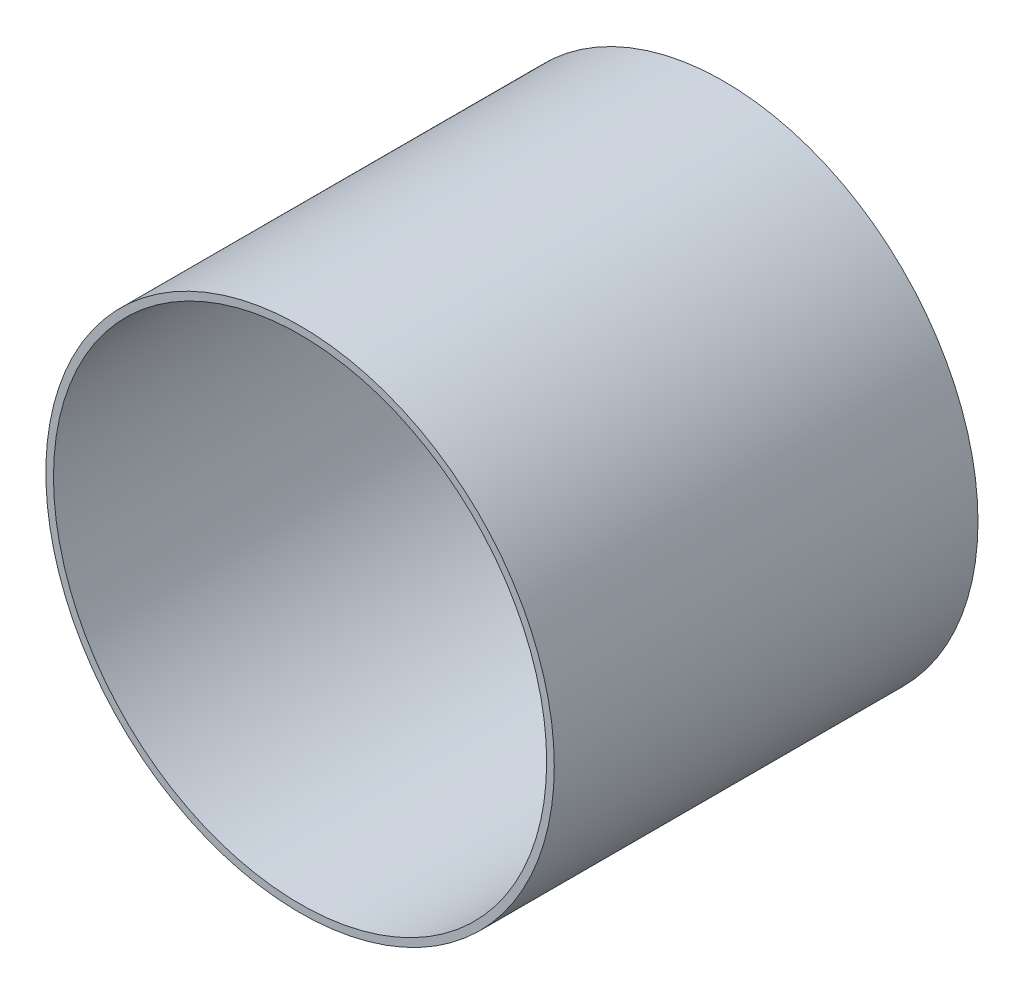
ISO-10303-21;
HEADER;
FILE_DESCRIPTION(('STEP AP214'),'2;1');
FILE_NAME('part.step','',(''),(''),'','','');
FILE_SCHEMA(('AUTOMOTIVE_DESIGN { 1 0 10303 214 1 1 1 1 }'));
ENDSEC;
DATA;
#1=APPLICATION_CONTEXT('core data for automotive mechanical design processes');
#2=APPLICATION_PROTOCOL_DEFINITION('international standard','automotive_design',2000,#1);
#3=PRODUCT_CONTEXT('',#1,'mechanical');
#4=PRODUCT('Part','Part','',(#3));
#5=PRODUCT_RELATED_PRODUCT_CATEGORY('part','',(#4));
#6=PRODUCT_DEFINITION_FORMATION('','',#4);
#7=PRODUCT_DEFINITION_CONTEXT('part definition',#1,'design');
#8=PRODUCT_DEFINITION('design','',#6,#7);
#9=PRODUCT_DEFINITION_SHAPE('','',#8);
#10=(LENGTH_UNIT() NAMED_UNIT(*) SI_UNIT(.MILLI.,.METRE.));
#11=(NAMED_UNIT(*) PLANE_ANGLE_UNIT() SI_UNIT($,.RADIAN.));
#12=(NAMED_UNIT(*) SI_UNIT($,.STERADIAN.) SOLID_ANGLE_UNIT());
#13=UNCERTAINTY_MEASURE_WITH_UNIT(LENGTH_MEASURE(1.E-05),#10,'distance_accuracy_value','');
#14=(GEOMETRIC_REPRESENTATION_CONTEXT(3) GLOBAL_UNCERTAINTY_ASSIGNED_CONTEXT((#13)) GLOBAL_UNIT_ASSIGNED_CONTEXT((#10,
#11,#12)) REPRESENTATION_CONTEXT('',''));
#15=CARTESIAN_POINT('',(0.,0.,0.));
#16=DIRECTION('',(0.,0.,1.));
#17=DIRECTION('',(1.,0.,0.));
#18=AXIS2_PLACEMENT_3D('',#15,#16,#17);
#19=CARTESIAN_POINT('',(0.,0.,25.));
#20=DIRECTION('',(0.,0.,1.));
#21=DIRECTION('',(1.,0.,0.));
#22=AXIS2_PLACEMENT_3D('',#19,#20,#21);
#23=PLANE('',#22);
#24=CARTESIAN_POINT('',(0.,0.,25.));
#25=DIRECTION('',(0.,0.,1.));
#26=DIRECTION('',(1.,0.,0.));
#27=AXIS2_PLACEMENT_3D('',#24,#25,#26);
#28=CIRCLE('',#27,15.);
#29=CARTESIAN_POINT('',(15.,0.,25.));
#30=VERTEX_POINT('',#29);
#31=EDGE_CURVE('E10',#30,#30,#28,.T.);
#32=ORIENTED_EDGE('',*,*,#31,.T.);
#33=EDGE_LOOP('',(#32));
#34=FACE_BOUND('',#33,.T.);
#35=CARTESIAN_POINT('',(0.,0.,25.));
#36=DIRECTION('',(0.,0.,1.));
#37=DIRECTION('',(1.,0.,0.));
#38=AXIS2_PLACEMENT_3D('',#35,#36,#37);
#39=CIRCLE('',#38,14.55);
#40=CARTESIAN_POINT('',(14.55,0.,25.));
#41=VERTEX_POINT('',#40);
#42=EDGE_CURVE('E42',#41,#41,#39,.T.);
#43=ORIENTED_EDGE('',*,*,#42,.F.);
#44=EDGE_LOOP('',(#43));
#45=FACE_BOUND('',#44,.T.);
#46=ADVANCED_FACE('F31',(#34,#45),#23,.T.);
#47=CARTESIAN_POINT('',(0.,0.,0.));
#48=DIRECTION('',(0.,0.,1.));
#49=DIRECTION('',(1.,0.,0.));
#50=AXIS2_PLACEMENT_3D('',#47,#48,#49);
#51=PLANE('',#50);
#52=CARTESIAN_POINT('',(0.,0.,0.));
#53=DIRECTION('',(0.,0.,1.));
#54=DIRECTION('',(1.,0.,0.));
#55=AXIS2_PLACEMENT_3D('',#52,#53,#54);
#56=CIRCLE('',#55,15.);
#57=CARTESIAN_POINT('',(15.,0.,0.));
#58=VERTEX_POINT('',#57);
#59=EDGE_CURVE('E35',#58,#58,#56,.T.);
#60=ORIENTED_EDGE('',*,*,#59,.F.);
#61=EDGE_LOOP('',(#60));
#62=FACE_BOUND('',#61,.T.);
#63=CARTESIAN_POINT('',(0.,0.,0.));
#64=DIRECTION('',(0.,0.,1.));
#65=DIRECTION('',(1.,0.,0.));
#66=AXIS2_PLACEMENT_3D('',#63,#64,#65);
#67=CIRCLE('',#66,14.55);
#68=CARTESIAN_POINT('',(14.55,0.,0.));
#69=VERTEX_POINT('',#68);
#70=EDGE_CURVE('E44',#69,#69,#67,.T.);
#71=ORIENTED_EDGE('',*,*,#70,.T.);
#72=EDGE_LOOP('',(#71));
#73=FACE_BOUND('',#72,.T.);
#74=ADVANCED_FACE('F54',(#62,#73),#51,.F.);
#75=CARTESIAN_POINT('',(0.,0.,25.));
#76=DIRECTION('',(0.,0.,-1.));
#77=DIRECTION('',(-1.,0.,0.));
#78=AXIS2_PLACEMENT_3D('',#75,#76,#77);
#79=CYLINDRICAL_SURFACE('',#78,15.);
#80=ORIENTED_EDGE('',*,*,#31,.F.);
#81=EDGE_LOOP('',(#80));
#82=FACE_BOUND('',#81,.T.);
#83=ORIENTED_EDGE('',*,*,#59,.T.);
#84=EDGE_LOOP('',(#83));
#85=FACE_BOUND('',#84,.T.);
#86=ADVANCED_FACE('F33',(#82,#85),#79,.T.);
#87=CARTESIAN_POINT('',(0.,0.,25.));
#88=DIRECTION('',(0.,0.,-1.));
#89=DIRECTION('',(-1.,0.,0.));
#90=AXIS2_PLACEMENT_3D('',#87,#88,#89);
#91=CYLINDRICAL_SURFACE('',#90,14.55);
#92=ORIENTED_EDGE('',*,*,#42,.T.);
#93=EDGE_LOOP('',(#92));
#94=FACE_BOUND('',#93,.T.);
#95=ORIENTED_EDGE('',*,*,#70,.F.);
#96=EDGE_LOOP('',(#95));
#97=FACE_BOUND('',#96,.T.);
#98=ADVANCED_FACE('F50',(#94,#97),#91,.F.);
#99=CLOSED_SHELL('',(#46,#74,#86,#98));
#100=MANIFOLD_SOLID_BREP('B2',#99);
#101=ADVANCED_BREP_SHAPE_REPRESENTATION('',(#18,#100),#14);
#102=SHAPE_DEFINITION_REPRESENTATION(#9,#101);
ENDSEC;
END-ISO-10303-21;
